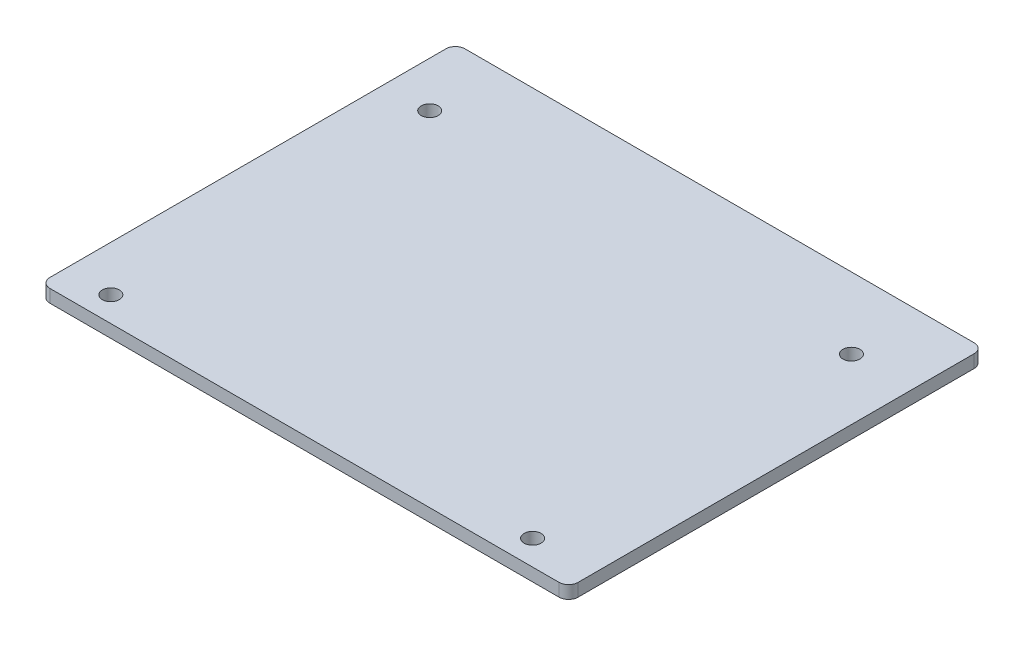
ISO-10303-21;
HEADER;
FILE_DESCRIPTION(('STEP AP214'),'2;1');
FILE_NAME('part.step','',(''),(''),'','','');
FILE_SCHEMA(('AUTOMOTIVE_DESIGN { 1 0 10303 214 1 1 1 1 }'));
ENDSEC;
DATA;
#1=APPLICATION_CONTEXT('core data for automotive mechanical design processes');
#2=APPLICATION_PROTOCOL_DEFINITION('international standard','automotive_design',2000,#1);
#3=PRODUCT_CONTEXT('',#1,'mechanical');
#4=PRODUCT('Part','Part','',(#3));
#5=PRODUCT_RELATED_PRODUCT_CATEGORY('part','',(#4));
#6=PRODUCT_DEFINITION_FORMATION('','',#4);
#7=PRODUCT_DEFINITION_CONTEXT('part definition',#1,'design');
#8=PRODUCT_DEFINITION('design','',#6,#7);
#9=PRODUCT_DEFINITION_SHAPE('','',#8);
#10=(LENGTH_UNIT() NAMED_UNIT(*) SI_UNIT(.MILLI.,.METRE.));
#11=(NAMED_UNIT(*) PLANE_ANGLE_UNIT() SI_UNIT($,.RADIAN.));
#12=(NAMED_UNIT(*) SI_UNIT($,.STERADIAN.) SOLID_ANGLE_UNIT());
#13=UNCERTAINTY_MEASURE_WITH_UNIT(LENGTH_MEASURE(1.E-05),#10,'distance_accuracy_value','');
#14=(GEOMETRIC_REPRESENTATION_CONTEXT(3) GLOBAL_UNCERTAINTY_ASSIGNED_CONTEXT((#13)) GLOBAL_UNIT_ASSIGNED_CONTEXT((#10,
#11,#12)) REPRESENTATION_CONTEXT('',''));
#15=CARTESIAN_POINT('',(0.,0.,0.));
#16=DIRECTION('',(0.,0.,1.));
#17=DIRECTION('',(1.,0.,0.));
#18=AXIS2_PLACEMENT_3D('',#15,#16,#17);
#19=CARTESIAN_POINT('',(0.,2.5,0.));
#20=DIRECTION('',(0.,-1.,0.));
#21=DIRECTION('',(0.,0.,-1.));
#22=AXIS2_PLACEMENT_3D('',#19,#20,#21);
#23=PLANE('',#22);
#24=CARTESIAN_POINT('',(-42.5,2.5,-26.5));
#25=DIRECTION('',(0.,1.,0.));
#26=DIRECTION('',(0.,0.,1.));
#27=AXIS2_PLACEMENT_3D('',#24,#25,#26);
#28=CIRCLE('',#27,1.65);
#29=CARTESIAN_POINT('',(-42.5,2.5,-24.85));
#30=VERTEX_POINT('',#29);
#31=EDGE_CURVE('E42',#30,#30,#28,.T.);
#32=ORIENTED_EDGE('',*,*,#31,.F.);
#33=EDGE_LOOP('',(#32));
#34=FACE_BOUND('',#33,.T.);
#35=CARTESIAN_POINT('',(39.5,2.5,-26.5));
#36=DIRECTION('',(0.,1.,0.));
#37=DIRECTION('',(0.,0.,1.));
#38=AXIS2_PLACEMENT_3D('',#35,#36,#37);
#39=CIRCLE('',#38,1.65);
#40=CARTESIAN_POINT('',(39.5,2.5,-24.85));
#41=VERTEX_POINT('',#40);
#42=EDGE_CURVE('E198',#41,#41,#39,.T.);
#43=ORIENTED_EDGE('',*,*,#42,.F.);
#44=EDGE_LOOP('',(#43));
#45=FACE_BOUND('',#44,.T.);
#46=CARTESIAN_POINT('',(39.5,2.5,35.5));
#47=DIRECTION('',(0.,1.,0.));
#48=DIRECTION('',(0.,0.,1.));
#49=AXIS2_PLACEMENT_3D('',#46,#47,#48);
#50=CIRCLE('',#49,1.65);
#51=CARTESIAN_POINT('',(39.5,2.5,37.15));
#52=VERTEX_POINT('',#51);
#53=EDGE_CURVE('E206',#52,#52,#50,.T.);
#54=ORIENTED_EDGE('',*,*,#53,.F.);
#55=EDGE_LOOP('',(#54));
#56=FACE_BOUND('',#55,.T.);
#57=CARTESIAN_POINT('',(-42.5,2.5,35.5));
#58=DIRECTION('',(0.,1.,0.));
#59=DIRECTION('',(0.,0.,1.));
#60=AXIS2_PLACEMENT_3D('',#57,#58,#59);
#61=CIRCLE('',#60,1.65);
#62=CARTESIAN_POINT('',(-42.5,2.5,37.15));
#63=VERTEX_POINT('',#62);
#64=EDGE_CURVE('E178',#63,#63,#61,.T.);
#65=ORIENTED_EDGE('',*,*,#64,.F.);
#66=EDGE_LOOP('',(#65));
#67=FACE_BOUND('',#66,.T.);
#68=CARTESIAN_POINT('',(49.5,2.5,-38.5));
#69=DIRECTION('',(0.,1.,0.));
#70=DIRECTION('',(0.,0.,1.));
#71=AXIS2_PLACEMENT_3D('',#68,#69,#70);
#72=CIRCLE('',#71,1.85);
#73=CARTESIAN_POINT('',(51.35,2.5,-38.5));
#74=VERTEX_POINT('',#73);
#75=CARTESIAN_POINT('',(49.5,2.5,-40.35));
#76=VERTEX_POINT('',#75);
#77=EDGE_CURVE('E147',#74,#76,#72,.T.);
#78=ORIENTED_EDGE('',*,*,#77,.T.);
#79=DIRECTION('',(-1.,0.,0.));
#80=VECTOR('',#79,1.);
#81=CARTESIAN_POINT('',(49.5,2.5,-40.35));
#82=LINE('',#81,#80);
#83=CARTESIAN_POINT('',(-49.5,2.5,-40.35));
#84=VERTEX_POINT('',#83);
#85=EDGE_CURVE('E151',#76,#84,#82,.T.);
#86=ORIENTED_EDGE('',*,*,#85,.T.);
#87=CARTESIAN_POINT('',(-49.5,2.5,-38.5));
#88=DIRECTION('',(0.,1.,0.));
#89=DIRECTION('',(0.,0.,1.));
#90=AXIS2_PLACEMENT_3D('',#87,#88,#89);
#91=CIRCLE('',#90,1.85);
#92=CARTESIAN_POINT('',(-51.35,2.5,-38.5));
#93=VERTEX_POINT('',#92);
#94=EDGE_CURVE('E54',#84,#93,#91,.T.);
#95=ORIENTED_EDGE('',*,*,#94,.T.);
#96=DIRECTION('',(0.,0.,1.));
#97=VECTOR('',#96,1.);
#98=CARTESIAN_POINT('',(-51.35,2.5,-38.5));
#99=LINE('',#98,#97);
#100=CARTESIAN_POINT('',(-51.35,2.5,38.5));
#101=VERTEX_POINT('',#100);
#102=EDGE_CURVE('E111',#93,#101,#99,.T.);
#103=ORIENTED_EDGE('',*,*,#102,.T.);
#104=CARTESIAN_POINT('',(-49.5,2.5,38.5));
#105=DIRECTION('',(0.,1.,0.));
#106=DIRECTION('',(0.,0.,1.));
#107=AXIS2_PLACEMENT_3D('',#104,#105,#106);
#108=CIRCLE('',#107,1.85);
#109=CARTESIAN_POINT('',(-49.5,2.5,40.35));
#110=VERTEX_POINT('',#109);
#111=EDGE_CURVE('E159',#101,#110,#108,.T.);
#112=ORIENTED_EDGE('',*,*,#111,.T.);
#113=DIRECTION('',(1.,0.,0.));
#114=VECTOR('',#113,1.);
#115=CARTESIAN_POINT('',(-49.5,2.5,40.35));
#116=LINE('',#115,#114);
#117=CARTESIAN_POINT('',(49.5,2.5,40.35));
#118=VERTEX_POINT('',#117);
#119=EDGE_CURVE('E163',#110,#118,#116,.T.);
#120=ORIENTED_EDGE('',*,*,#119,.T.);
#121=CARTESIAN_POINT('',(49.5,2.5,38.5));
#122=DIRECTION('',(0.,1.,0.));
#123=DIRECTION('',(0.,0.,1.));
#124=AXIS2_PLACEMENT_3D('',#121,#122,#123);
#125=CIRCLE('',#124,1.85);
#126=CARTESIAN_POINT('',(51.35,2.5,38.5));
#127=VERTEX_POINT('',#126);
#128=EDGE_CURVE('E167',#118,#127,#125,.T.);
#129=ORIENTED_EDGE('',*,*,#128,.T.);
#130=DIRECTION('',(0.,0.,-1.));
#131=VECTOR('',#130,1.);
#132=CARTESIAN_POINT('',(51.35,2.5,38.5));
#133=LINE('',#132,#131);
#134=EDGE_CURVE('E171',#127,#74,#133,.T.);
#135=ORIENTED_EDGE('',*,*,#134,.T.);
#136=EDGE_LOOP('',(#78,#86,#95,#103,#112,#120,#129,#135));
#137=FACE_BOUND('',#136,.T.);
#138=ADVANCED_FACE('F38',(#34,#45,#56,#67,#137),#23,.F.);
#139=CARTESIAN_POINT('',(0.,0.,0.));
#140=DIRECTION('',(0.,-1.,0.));
#141=DIRECTION('',(0.,0.,-1.));
#142=AXIS2_PLACEMENT_3D('',#139,#140,#141);
#143=PLANE('',#142);
#144=CARTESIAN_POINT('',(-42.5,0.,-26.5));
#145=DIRECTION('',(0.,1.,0.));
#146=DIRECTION('',(0.,0.,1.));
#147=AXIS2_PLACEMENT_3D('',#144,#145,#146);
#148=CIRCLE('',#147,1.65);
#149=CARTESIAN_POINT('',(-42.5,0.,-24.85));
#150=VERTEX_POINT('',#149);
#151=EDGE_CURVE('E11',#150,#150,#148,.T.);
#152=ORIENTED_EDGE('',*,*,#151,.T.);
#153=EDGE_LOOP('',(#152));
#154=FACE_BOUND('',#153,.T.);
#155=CARTESIAN_POINT('',(39.5,0.,-26.5));
#156=DIRECTION('',(0.,1.,0.));
#157=DIRECTION('',(0.,0.,1.));
#158=AXIS2_PLACEMENT_3D('',#155,#156,#157);
#159=CIRCLE('',#158,1.65);
#160=CARTESIAN_POINT('',(39.5,0.,-24.85));
#161=VERTEX_POINT('',#160);
#162=EDGE_CURVE('E194',#161,#161,#159,.T.);
#163=ORIENTED_EDGE('',*,*,#162,.T.);
#164=EDGE_LOOP('',(#163));
#165=FACE_BOUND('',#164,.T.);
#166=CARTESIAN_POINT('',(39.5,0.,35.5));
#167=DIRECTION('',(0.,1.,0.));
#168=DIRECTION('',(0.,0.,1.));
#169=AXIS2_PLACEMENT_3D('',#166,#167,#168);
#170=CIRCLE('',#169,1.65);
#171=CARTESIAN_POINT('',(39.5,0.,37.15));
#172=VERTEX_POINT('',#171);
#173=EDGE_CURVE('E202',#172,#172,#170,.T.);
#174=ORIENTED_EDGE('',*,*,#173,.T.);
#175=EDGE_LOOP('',(#174));
#176=FACE_BOUND('',#175,.T.);
#177=CARTESIAN_POINT('',(-42.5,0.,35.5));
#178=DIRECTION('',(0.,1.,0.));
#179=DIRECTION('',(0.,0.,1.));
#180=AXIS2_PLACEMENT_3D('',#177,#178,#179);
#181=CIRCLE('',#180,1.65);
#182=CARTESIAN_POINT('',(-42.5,0.,37.15));
#183=VERTEX_POINT('',#182);
#184=EDGE_CURVE('E210',#183,#183,#181,.T.);
#185=ORIENTED_EDGE('',*,*,#184,.T.);
#186=EDGE_LOOP('',(#185));
#187=FACE_BOUND('',#186,.T.);
#188=DIRECTION('',(-1.,0.,0.));
#189=VECTOR('',#188,1.);
#190=CARTESIAN_POINT('',(49.5,0.,-40.35));
#191=LINE('',#190,#189);
#192=CARTESIAN_POINT('',(49.5,0.,-40.35));
#193=VERTEX_POINT('',#192);
#194=CARTESIAN_POINT('',(-49.5,0.,-40.35));
#195=VERTEX_POINT('',#194);
#196=EDGE_CURVE('E123',#193,#195,#191,.T.);
#197=ORIENTED_EDGE('',*,*,#196,.F.);
#198=CARTESIAN_POINT('',(49.5,0.,-38.5));
#199=DIRECTION('',(0.,1.,0.));
#200=DIRECTION('',(0.,0.,1.));
#201=AXIS2_PLACEMENT_3D('',#198,#199,#200);
#202=CIRCLE('',#201,1.85);
#203=CARTESIAN_POINT('',(51.35,0.,-38.5));
#204=VERTEX_POINT('',#203);
#205=EDGE_CURVE('E62',#204,#193,#202,.T.);
#206=ORIENTED_EDGE('',*,*,#205,.F.);
#207=DIRECTION('',(0.,0.,-1.));
#208=VECTOR('',#207,1.);
#209=CARTESIAN_POINT('',(51.35,0.,38.5));
#210=LINE('',#209,#208);
#211=CARTESIAN_POINT('',(51.35,0.,38.5));
#212=VERTEX_POINT('',#211);
#213=EDGE_CURVE('E142',#212,#204,#210,.T.);
#214=ORIENTED_EDGE('',*,*,#213,.F.);
#215=CARTESIAN_POINT('',(49.5,0.,38.5));
#216=DIRECTION('',(0.,1.,0.));
#217=DIRECTION('',(0.,0.,1.));
#218=AXIS2_PLACEMENT_3D('',#215,#216,#217);
#219=CIRCLE('',#218,1.85);
#220=CARTESIAN_POINT('',(49.5,0.,40.35));
#221=VERTEX_POINT('',#220);
#222=EDGE_CURVE('E138',#221,#212,#219,.T.);
#223=ORIENTED_EDGE('',*,*,#222,.F.);
#224=DIRECTION('',(1.,0.,0.));
#225=VECTOR('',#224,1.);
#226=CARTESIAN_POINT('',(-49.5,0.,40.35));
#227=LINE('',#226,#225);
#228=CARTESIAN_POINT('',(-49.5,0.,40.35));
#229=VERTEX_POINT('',#228);
#230=EDGE_CURVE('E131',#229,#221,#227,.T.);
#231=ORIENTED_EDGE('',*,*,#230,.F.);
#232=CARTESIAN_POINT('',(-49.5,0.,38.5));
#233=DIRECTION('',(0.,1.,0.));
#234=DIRECTION('',(0.,0.,1.));
#235=AXIS2_PLACEMENT_3D('',#232,#233,#234);
#236=CIRCLE('',#235,1.85);
#237=CARTESIAN_POINT('',(-51.35,0.,38.5));
#238=VERTEX_POINT('',#237);
#239=EDGE_CURVE('E127',#238,#229,#236,.T.);
#240=ORIENTED_EDGE('',*,*,#239,.F.);
#241=DIRECTION('',(0.,0.,1.));
#242=VECTOR('',#241,1.);
#243=CARTESIAN_POINT('',(-51.35,0.,-38.5));
#244=LINE('',#243,#242);
#245=CARTESIAN_POINT('',(-51.35,0.,-38.5));
#246=VERTEX_POINT('',#245);
#247=EDGE_CURVE('E108',#246,#238,#244,.T.);
#248=ORIENTED_EDGE('',*,*,#247,.F.);
#249=CARTESIAN_POINT('',(-49.5,0.,-38.5));
#250=DIRECTION('',(0.,1.,0.));
#251=DIRECTION('',(0.,0.,1.));
#252=AXIS2_PLACEMENT_3D('',#249,#250,#251);
#253=CIRCLE('',#252,1.85);
#254=EDGE_CURVE('E117',#195,#246,#253,.T.);
#255=ORIENTED_EDGE('',*,*,#254,.F.);
#256=EDGE_LOOP('',(#197,#206,#214,#223,#231,#240,#248,#255));
#257=FACE_BOUND('',#256,.T.);
#258=ADVANCED_FACE('F40',(#154,#165,#176,#187,#257),#143,.T.);
#259=CARTESIAN_POINT('',(-42.5,0.,-26.5));
#260=DIRECTION('',(0.,1.,0.));
#261=DIRECTION('',(0.,0.,1.));
#262=AXIS2_PLACEMENT_3D('',#259,#260,#261);
#263=CYLINDRICAL_SURFACE('',#262,1.65);
#264=ORIENTED_EDGE('',*,*,#151,.F.);
#265=EDGE_LOOP('',(#264));
#266=FACE_BOUND('',#265,.T.);
#267=ORIENTED_EDGE('',*,*,#31,.T.);
#268=EDGE_LOOP('',(#267));
#269=FACE_BOUND('',#268,.T.);
#270=ADVANCED_FACE('F265',(#266,#269),#263,.F.);
#271=CARTESIAN_POINT('',(39.5,0.,-26.5));
#272=DIRECTION('',(0.,1.,0.));
#273=DIRECTION('',(0.,0.,1.));
#274=AXIS2_PLACEMENT_3D('',#271,#272,#273);
#275=CYLINDRICAL_SURFACE('',#274,1.65);
#276=ORIENTED_EDGE('',*,*,#162,.F.);
#277=EDGE_LOOP('',(#276));
#278=FACE_BOUND('',#277,.T.);
#279=ORIENTED_EDGE('',*,*,#42,.T.);
#280=EDGE_LOOP('',(#279));
#281=FACE_BOUND('',#280,.T.);
#282=ADVANCED_FACE('F261',(#278,#281),#275,.F.);
#283=CARTESIAN_POINT('',(39.5,0.,35.5));
#284=DIRECTION('',(0.,1.,0.));
#285=DIRECTION('',(0.,0.,1.));
#286=AXIS2_PLACEMENT_3D('',#283,#284,#285);
#287=CYLINDRICAL_SURFACE('',#286,1.65);
#288=ORIENTED_EDGE('',*,*,#173,.F.);
#289=EDGE_LOOP('',(#288));
#290=FACE_BOUND('',#289,.T.);
#291=ORIENTED_EDGE('',*,*,#53,.T.);
#292=EDGE_LOOP('',(#291));
#293=FACE_BOUND('',#292,.T.);
#294=ADVANCED_FACE('F264',(#290,#293),#287,.F.);
#295=CARTESIAN_POINT('',(-42.5,0.,35.5));
#296=DIRECTION('',(0.,1.,0.));
#297=DIRECTION('',(0.,0.,1.));
#298=AXIS2_PLACEMENT_3D('',#295,#296,#297);
#299=CYLINDRICAL_SURFACE('',#298,1.65);
#300=ORIENTED_EDGE('',*,*,#184,.F.);
#301=EDGE_LOOP('',(#300));
#302=FACE_BOUND('',#301,.T.);
#303=ORIENTED_EDGE('',*,*,#64,.T.);
#304=EDGE_LOOP('',(#303));
#305=FACE_BOUND('',#304,.T.);
#306=ADVANCED_FACE('F218',(#302,#305),#299,.F.);
#307=CARTESIAN_POINT('',(49.5,0.,-38.5));
#308=DIRECTION('',(0.,1.,0.));
#309=DIRECTION('',(0.,0.,1.));
#310=AXIS2_PLACEMENT_3D('',#307,#308,#309);
#311=CYLINDRICAL_SURFACE('',#310,1.85);
#312=ORIENTED_EDGE('',*,*,#77,.F.);
#313=DIRECTION('',(0.,1.,0.));
#314=VECTOR('',#313,1.);
#315=CARTESIAN_POINT('',(51.35,0.,-38.5));
#316=LINE('',#315,#314);
#317=EDGE_CURVE('E175',#204,#74,#316,.T.);
#318=ORIENTED_EDGE('',*,*,#317,.F.);
#319=ORIENTED_EDGE('',*,*,#205,.T.);
#320=DIRECTION('',(0.,1.,0.));
#321=VECTOR('',#320,1.);
#322=CARTESIAN_POINT('',(49.5,0.,-40.35));
#323=LINE('',#322,#321);
#324=EDGE_CURVE('E146',#193,#76,#323,.T.);
#325=ORIENTED_EDGE('',*,*,#324,.T.);
#326=EDGE_LOOP('',(#312,#318,#319,#325));
#327=FACE_BOUND('',#326,.T.);
#328=ADVANCED_FACE('F226',(#327),#311,.T.);
#329=CARTESIAN_POINT('',(51.35,0.,38.5));
#330=DIRECTION('',(1.,0.,0.));
#331=DIRECTION('',(0.,0.,-1.));
#332=AXIS2_PLACEMENT_3D('',#329,#330,#331);
#333=PLANE('',#332);
#334=ORIENTED_EDGE('',*,*,#134,.F.);
#335=DIRECTION('',(0.,1.,0.));
#336=VECTOR('',#335,1.);
#337=CARTESIAN_POINT('',(51.35,0.,38.5));
#338=LINE('',#337,#336);
#339=EDGE_CURVE('E179',#212,#127,#338,.T.);
#340=ORIENTED_EDGE('',*,*,#339,.F.);
#341=ORIENTED_EDGE('',*,*,#213,.T.);
#342=ORIENTED_EDGE('',*,*,#317,.T.);
#343=EDGE_LOOP('',(#334,#340,#341,#342));
#344=FACE_BOUND('',#343,.T.);
#345=ADVANCED_FACE('F235',(#344),#333,.T.);
#346=CARTESIAN_POINT('',(49.5,0.,38.5));
#347=DIRECTION('',(0.,1.,0.));
#348=DIRECTION('',(0.,0.,1.));
#349=AXIS2_PLACEMENT_3D('',#346,#347,#348);
#350=CYLINDRICAL_SURFACE('',#349,1.85);
#351=ORIENTED_EDGE('',*,*,#128,.F.);
#352=DIRECTION('',(0.,1.,0.));
#353=VECTOR('',#352,1.);
#354=CARTESIAN_POINT('',(49.5,0.,40.35));
#355=LINE('',#354,#353);
#356=EDGE_CURVE('E182',#221,#118,#355,.T.);
#357=ORIENTED_EDGE('',*,*,#356,.F.);
#358=ORIENTED_EDGE('',*,*,#222,.T.);
#359=ORIENTED_EDGE('',*,*,#339,.T.);
#360=EDGE_LOOP('',(#351,#357,#358,#359));
#361=FACE_BOUND('',#360,.T.);
#362=ADVANCED_FACE('F238',(#361),#350,.T.);
#363=CARTESIAN_POINT('',(-49.5,0.,40.35));
#364=DIRECTION('',(0.,0.,1.));
#365=DIRECTION('',(1.,0.,0.));
#366=AXIS2_PLACEMENT_3D('',#363,#364,#365);
#367=PLANE('',#366);
#368=ORIENTED_EDGE('',*,*,#119,.F.);
#369=DIRECTION('',(0.,1.,0.));
#370=VECTOR('',#369,1.);
#371=CARTESIAN_POINT('',(-49.5,0.,40.35));
#372=LINE('',#371,#370);
#373=EDGE_CURVE('E185',#229,#110,#372,.T.);
#374=ORIENTED_EDGE('',*,*,#373,.F.);
#375=ORIENTED_EDGE('',*,*,#230,.T.);
#376=ORIENTED_EDGE('',*,*,#356,.T.);
#377=EDGE_LOOP('',(#368,#374,#375,#376));
#378=FACE_BOUND('',#377,.T.);
#379=ADVANCED_FACE('F241',(#378),#367,.T.);
#380=CARTESIAN_POINT('',(-49.5,0.,38.5));
#381=DIRECTION('',(0.,1.,0.));
#382=DIRECTION('',(0.,0.,1.));
#383=AXIS2_PLACEMENT_3D('',#380,#381,#382);
#384=CYLINDRICAL_SURFACE('',#383,1.85);
#385=ORIENTED_EDGE('',*,*,#111,.F.);
#386=DIRECTION('',(0.,1.,0.));
#387=VECTOR('',#386,1.);
#388=CARTESIAN_POINT('',(-51.35,0.,38.5));
#389=LINE('',#388,#387);
#390=EDGE_CURVE('E113',#238,#101,#389,.T.);
#391=ORIENTED_EDGE('',*,*,#390,.F.);
#392=ORIENTED_EDGE('',*,*,#239,.T.);
#393=ORIENTED_EDGE('',*,*,#373,.T.);
#394=EDGE_LOOP('',(#385,#391,#392,#393));
#395=FACE_BOUND('',#394,.T.);
#396=ADVANCED_FACE('F244',(#395),#384,.T.);
#397=CARTESIAN_POINT('',(-51.35,0.,-38.5));
#398=DIRECTION('',(-1.,0.,0.));
#399=DIRECTION('',(0.,0.,1.));
#400=AXIS2_PLACEMENT_3D('',#397,#398,#399);
#401=PLANE('',#400);
#402=ORIENTED_EDGE('',*,*,#102,.F.);
#403=DIRECTION('',(0.,1.,0.));
#404=VECTOR('',#403,1.);
#405=CARTESIAN_POINT('',(-51.35,0.,-38.5));
#406=LINE('',#405,#404);
#407=EDGE_CURVE('E104',#246,#93,#406,.T.);
#408=ORIENTED_EDGE('',*,*,#407,.F.);
#409=ORIENTED_EDGE('',*,*,#247,.T.);
#410=ORIENTED_EDGE('',*,*,#390,.T.);
#411=EDGE_LOOP('',(#402,#408,#409,#410));
#412=FACE_BOUND('',#411,.T.);
#413=ADVANCED_FACE('F106',(#412),#401,.T.);
#414=CARTESIAN_POINT('',(-49.5,0.,-38.5));
#415=DIRECTION('',(0.,1.,0.));
#416=DIRECTION('',(0.,0.,1.));
#417=AXIS2_PLACEMENT_3D('',#414,#415,#416);
#418=CYLINDRICAL_SURFACE('',#417,1.85);
#419=ORIENTED_EDGE('',*,*,#94,.F.);
#420=DIRECTION('',(0.,1.,0.));
#421=VECTOR('',#420,1.);
#422=CARTESIAN_POINT('',(-49.5,0.,-40.35));
#423=LINE('',#422,#421);
#424=EDGE_CURVE('E114',#195,#84,#423,.T.);
#425=ORIENTED_EDGE('',*,*,#424,.F.);
#426=ORIENTED_EDGE('',*,*,#254,.T.);
#427=ORIENTED_EDGE('',*,*,#407,.T.);
#428=EDGE_LOOP('',(#419,#425,#426,#427));
#429=FACE_BOUND('',#428,.T.);
#430=ADVANCED_FACE('F118',(#429),#418,.T.);
#431=CARTESIAN_POINT('',(49.5,0.,-40.35));
#432=DIRECTION('',(0.,0.,-1.));
#433=DIRECTION('',(-1.,0.,0.));
#434=AXIS2_PLACEMENT_3D('',#431,#432,#433);
#435=PLANE('',#434);
#436=ORIENTED_EDGE('',*,*,#85,.F.);
#437=ORIENTED_EDGE('',*,*,#324,.F.);
#438=ORIENTED_EDGE('',*,*,#196,.T.);
#439=ORIENTED_EDGE('',*,*,#424,.T.);
#440=EDGE_LOOP('',(#436,#437,#438,#439));
#441=FACE_BOUND('',#440,.T.);
#442=ADVANCED_FACE('F228',(#441),#435,.T.);
#443=CLOSED_SHELL('',(#138,#258,#270,#282,#294,#306,#328,#345,#362,#379,#396,#413,#430,#442));
#444=MANIFOLD_SOLID_BREP('B2',#443);
#445=ADVANCED_BREP_SHAPE_REPRESENTATION('',(#18,#444),#14);
#446=SHAPE_DEFINITION_REPRESENTATION(#9,#445);
ENDSEC;
END-ISO-10303-21;
